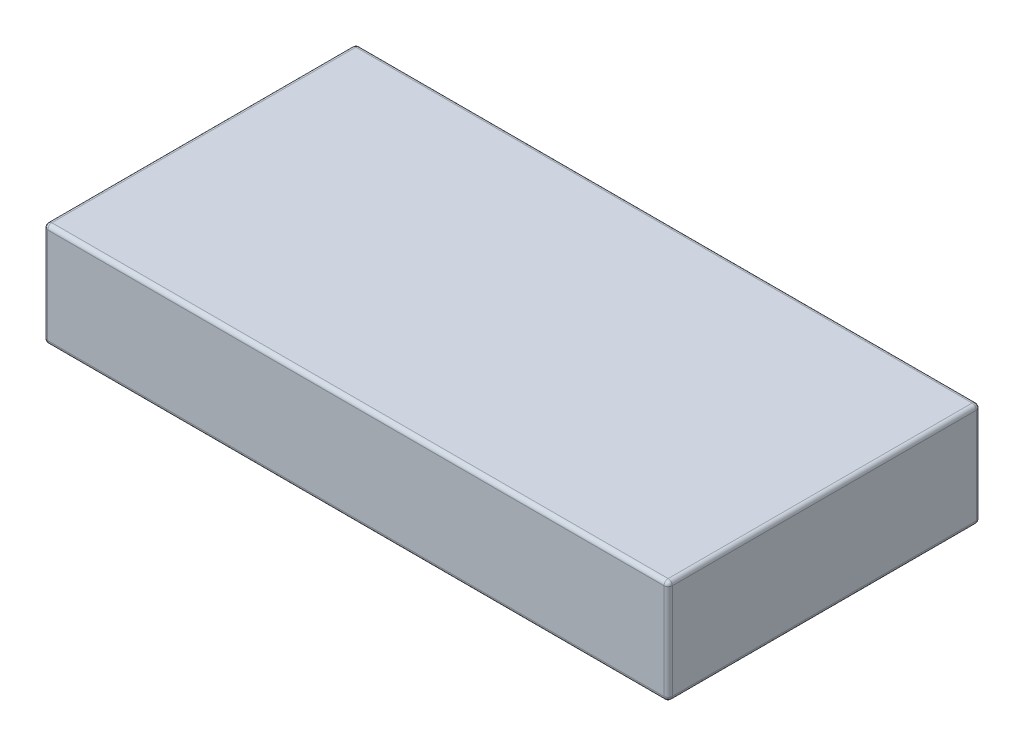
ISO-10303-21;
HEADER;
FILE_DESCRIPTION(('STEP AP214'),'2;1');
FILE_NAME('part.step','',(''),(''),'','','');
FILE_SCHEMA(('AUTOMOTIVE_DESIGN { 1 0 10303 214 1 1 1 1 }'));
ENDSEC;
DATA;
#1=APPLICATION_CONTEXT('core data for automotive mechanical design processes');
#2=APPLICATION_PROTOCOL_DEFINITION('international standard','automotive_design',2000,#1);
#3=PRODUCT_CONTEXT('',#1,'mechanical');
#4=PRODUCT('Part','Part','',(#3));
#5=PRODUCT_RELATED_PRODUCT_CATEGORY('part','',(#4));
#6=PRODUCT_DEFINITION_FORMATION('','',#4);
#7=PRODUCT_DEFINITION_CONTEXT('part definition',#1,'design');
#8=PRODUCT_DEFINITION('design','',#6,#7);
#9=PRODUCT_DEFINITION_SHAPE('','',#8);
#10=(LENGTH_UNIT() NAMED_UNIT(*) SI_UNIT(.MILLI.,.METRE.));
#11=(NAMED_UNIT(*) PLANE_ANGLE_UNIT() SI_UNIT($,.RADIAN.));
#12=(NAMED_UNIT(*) SI_UNIT($,.STERADIAN.) SOLID_ANGLE_UNIT());
#13=UNCERTAINTY_MEASURE_WITH_UNIT(LENGTH_MEASURE(1.E-05),#10,'distance_accuracy_value','');
#14=(GEOMETRIC_REPRESENTATION_CONTEXT(3) GLOBAL_UNCERTAINTY_ASSIGNED_CONTEXT((#13)) GLOBAL_UNIT_ASSIGNED_CONTEXT((#10,
#11,#12)) REPRESENTATION_CONTEXT('',''));
#15=CARTESIAN_POINT('',(0.,0.,0.));
#16=DIRECTION('',(0.,0.,1.));
#17=DIRECTION('',(1.,0.,0.));
#18=AXIS2_PLACEMENT_3D('',#15,#16,#17);
#19=CARTESIAN_POINT('',(-15.,5.,7.5));
#20=DIRECTION('',(1.,0.,0.));
#21=DIRECTION('',(0.,0.,-1.));
#22=AXIS2_PLACEMENT_3D('',#19,#20,#21);
#23=PLANE('',#22);
#24=DIRECTION('',(0.,-1.,0.));
#25=VECTOR('',#24,1.);
#26=CARTESIAN_POINT('',(-15.,5.,-7.3));
#27=LINE('',#26,#25);
#28=CARTESIAN_POINT('',(-15.,4.8,-7.3));
#29=VERTEX_POINT('',#28);
#30=CARTESIAN_POINT('',(-15.,0.2,-7.3));
#31=VERTEX_POINT('',#30);
#32=EDGE_CURVE('E270',#29,#31,#27,.T.);
#33=ORIENTED_EDGE('',*,*,#32,.T.);
#34=DIRECTION('',(0.,0.,1.));
#35=VECTOR('',#34,1.);
#36=CARTESIAN_POINT('',(-15.,0.2,-1.5));
#37=LINE('',#36,#35);
#38=CARTESIAN_POINT('',(-15.,0.2,-1.5));
#39=VERTEX_POINT('',#38);
#40=EDGE_CURVE('E273',#31,#39,#37,.T.);
#41=ORIENTED_EDGE('',*,*,#40,.T.);
#42=DIRECTION('',(0.,-1.,0.));
#43=VECTOR('',#42,1.);
#44=CARTESIAN_POINT('',(-15.,0.,-1.5));
#45=LINE('',#44,#43);
#46=CARTESIAN_POINT('',(-15.,0.677124344467704,-1.5));
#47=VERTEX_POINT('',#46);
#48=EDGE_CURVE('E226',#47,#39,#45,.T.);
#49=ORIENTED_EDGE('',*,*,#48,.F.);
#50=CARTESIAN_POINT('',(-15.,2.,0.));
#51=DIRECTION('',(-1.,0.,0.));
#52=DIRECTION('',(0.,0.,1.));
#53=AXIS2_PLACEMENT_3D('',#50,#51,#52);
#54=CIRCLE('',#53,2.);
#55=CARTESIAN_POINT('',(-15.,1.55559027913422,-1.95));
#56=VERTEX_POINT('',#55);
#57=EDGE_CURVE('E224',#56,#47,#54,.T.);
#58=ORIENTED_EDGE('',*,*,#57,.F.);
#59=DIRECTION('',(0.,-1.,0.));
#60=VECTOR('',#59,1.);
#61=CARTESIAN_POINT('',(-15.,2.8,-1.95));
#62=LINE('',#61,#60);
#63=CARTESIAN_POINT('',(-15.,2.8,-1.95));
#64=VERTEX_POINT('',#63);
#65=EDGE_CURVE('E190',#64,#56,#62,.T.);
#66=ORIENTED_EDGE('',*,*,#65,.F.);
#67=DIRECTION('',(0.,0.,-1.));
#68=VECTOR('',#67,1.);
#69=CARTESIAN_POINT('',(-15.,2.8,-1.95));
#70=LINE('',#69,#68);
#71=CARTESIAN_POINT('',(-15.,2.8,1.95));
#72=VERTEX_POINT('',#71);
#73=EDGE_CURVE('E208',#72,#64,#70,.T.);
#74=ORIENTED_EDGE('',*,*,#73,.F.);
#75=DIRECTION('',(0.,1.,0.));
#76=VECTOR('',#75,1.);
#77=CARTESIAN_POINT('',(-15.,2.8,1.95));
#78=LINE('',#77,#76);
#79=CARTESIAN_POINT('',(-15.,1.55559027913422,1.95));
#80=VERTEX_POINT('',#79);
#81=EDGE_CURVE('E211',#80,#72,#78,.T.);
#82=ORIENTED_EDGE('',*,*,#81,.F.);
#83=CARTESIAN_POINT('',(-15.,2.,0.));
#84=DIRECTION('',(-1.,0.,0.));
#85=DIRECTION('',(0.,0.,1.));
#86=AXIS2_PLACEMENT_3D('',#83,#84,#85);
#87=CIRCLE('',#86,2.);
#88=CARTESIAN_POINT('',(-15.,0.677124344467705,1.5));
#89=VERTEX_POINT('',#88);
#90=EDGE_CURVE('E231',#89,#80,#87,.T.);
#91=ORIENTED_EDGE('',*,*,#90,.F.);
#92=DIRECTION('',(0.,1.,0.));
#93=VECTOR('',#92,1.);
#94=CARTESIAN_POINT('',(-15.,0.,1.5));
#95=LINE('',#94,#93);
#96=CARTESIAN_POINT('',(-15.,0.2,1.5));
#97=VERTEX_POINT('',#96);
#98=EDGE_CURVE('E229',#97,#89,#95,.T.);
#99=ORIENTED_EDGE('',*,*,#98,.F.);
#100=DIRECTION('',(0.,0.,1.));
#101=VECTOR('',#100,1.);
#102=CARTESIAN_POINT('',(-15.,0.2,7.5));
#103=LINE('',#102,#101);
#104=CARTESIAN_POINT('',(-15.,0.2,7.3));
#105=VERTEX_POINT('',#104);
#106=EDGE_CURVE('E268',#97,#105,#103,.T.);
#107=ORIENTED_EDGE('',*,*,#106,.T.);
#108=DIRECTION('',(0.,-1.,0.));
#109=VECTOR('',#108,1.);
#110=CARTESIAN_POINT('',(-15.,5.,7.3));
#111=LINE('',#110,#109);
#112=CARTESIAN_POINT('',(-15.,4.8,7.3));
#113=VERTEX_POINT('',#112);
#114=EDGE_CURVE('E266',#105,#113,#111,.F.);
#115=ORIENTED_EDGE('',*,*,#114,.T.);
#116=DIRECTION('',(0.,0.,1.));
#117=VECTOR('',#116,1.);
#118=CARTESIAN_POINT('',(-15.,4.8,7.5));
#119=LINE('',#118,#117);
#120=EDGE_CURVE('E264',#113,#29,#119,.F.);
#121=ORIENTED_EDGE('',*,*,#120,.T.);
#122=EDGE_LOOP('',(#33,#41,#49,#58,#66,#74,#82,#91,#99,#107,#115,#121));
#123=FACE_BOUND('',#122,.T.);
#124=ADVANCED_FACE('F34',(#123),#23,.F.);
#125=CARTESIAN_POINT('',(-15.,5.,7.5));
#126=DIRECTION('',(0.,0.,-1.));
#127=DIRECTION('',(-1.,0.,0.));
#128=AXIS2_PLACEMENT_3D('',#125,#126,#127);
#129=PLANE('',#128);
#130=DIRECTION('',(0.,-1.,0.));
#131=VECTOR('',#130,1.);
#132=CARTESIAN_POINT('',(-14.8,5.,7.5));
#133=LINE('',#132,#131);
#134=CARTESIAN_POINT('',(-14.8,4.8,7.5));
#135=VERTEX_POINT('',#134);
#136=CARTESIAN_POINT('',(-14.8,0.2,7.5));
#137=VERTEX_POINT('',#136);
#138=EDGE_CURVE('E302',#135,#137,#133,.T.);
#139=ORIENTED_EDGE('',*,*,#138,.T.);
#140=DIRECTION('',(1.,0.,0.));
#141=VECTOR('',#140,1.);
#142=CARTESIAN_POINT('',(15.,0.2,7.5));
#143=LINE('',#142,#141);
#144=CARTESIAN_POINT('',(14.8,0.2,7.5));
#145=VERTEX_POINT('',#144);
#146=EDGE_CURVE('E305',#137,#145,#143,.T.);
#147=ORIENTED_EDGE('',*,*,#146,.T.);
#148=DIRECTION('',(0.,-1.,0.));
#149=VECTOR('',#148,1.);
#150=CARTESIAN_POINT('',(14.8,5.,7.5));
#151=LINE('',#150,#149);
#152=CARTESIAN_POINT('',(14.8,4.8,7.5));
#153=VERTEX_POINT('',#152);
#154=EDGE_CURVE('E300',#145,#153,#151,.F.);
#155=ORIENTED_EDGE('',*,*,#154,.T.);
#156=DIRECTION('',(1.,0.,0.));
#157=VECTOR('',#156,1.);
#158=CARTESIAN_POINT('',(-15.,4.8,7.5));
#159=LINE('',#158,#157);
#160=EDGE_CURVE('E298',#153,#135,#159,.F.);
#161=ORIENTED_EDGE('',*,*,#160,.T.);
#162=EDGE_LOOP('',(#139,#147,#155,#161));
#163=FACE_BOUND('',#162,.T.);
#164=ADVANCED_FACE('F443',(#163),#129,.F.);
#165=CARTESIAN_POINT('',(15.,5.,7.5));
#166=DIRECTION('',(-1.,0.,0.));
#167=DIRECTION('',(0.,0.,1.));
#168=AXIS2_PLACEMENT_3D('',#165,#166,#167);
#169=PLANE('',#168);
#170=DIRECTION('',(0.,0.,-1.));
#171=VECTOR('',#170,1.);
#172=CARTESIAN_POINT('',(15.,0.2,-7.5));
#173=LINE('',#172,#171);
#174=CARTESIAN_POINT('',(15.,0.2,7.3));
#175=VERTEX_POINT('',#174);
#176=CARTESIAN_POINT('',(15.,0.2,-7.3));
#177=VERTEX_POINT('',#176);
#178=EDGE_CURVE('E259',#175,#177,#173,.T.);
#179=ORIENTED_EDGE('',*,*,#178,.T.);
#180=DIRECTION('',(0.,-1.,0.));
#181=VECTOR('',#180,1.);
#182=CARTESIAN_POINT('',(15.,5.,-7.3));
#183=LINE('',#182,#181);
#184=CARTESIAN_POINT('',(15.,4.8,-7.3));
#185=VERTEX_POINT('',#184);
#186=EDGE_CURVE('E261',#177,#185,#183,.F.);
#187=ORIENTED_EDGE('',*,*,#186,.T.);
#188=DIRECTION('',(0.,0.,-1.));
#189=VECTOR('',#188,1.);
#190=CARTESIAN_POINT('',(15.,4.8,7.5));
#191=LINE('',#190,#189);
#192=CARTESIAN_POINT('',(15.,4.8,7.3));
#193=VERTEX_POINT('',#192);
#194=EDGE_CURVE('E255',#185,#193,#191,.F.);
#195=ORIENTED_EDGE('',*,*,#194,.T.);
#196=DIRECTION('',(0.,-1.,0.));
#197=VECTOR('',#196,1.);
#198=CARTESIAN_POINT('',(15.,5.,7.3));
#199=LINE('',#198,#197);
#200=EDGE_CURVE('E257',#193,#175,#199,.T.);
#201=ORIENTED_EDGE('',*,*,#200,.T.);
#202=EDGE_LOOP('',(#179,#187,#195,#201));
#203=FACE_BOUND('',#202,.T.);
#204=ADVANCED_FACE('F495',(#203),#169,.F.);
#205=CARTESIAN_POINT('',(-15.,5.,-7.5));
#206=DIRECTION('',(0.,0.,1.));
#207=DIRECTION('',(1.,0.,0.));
#208=AXIS2_PLACEMENT_3D('',#205,#206,#207);
#209=PLANE('',#208);
#210=DIRECTION('',(0.,-1.,0.));
#211=VECTOR('',#210,1.);
#212=CARTESIAN_POINT('',(14.8,5.,-7.5));
#213=LINE('',#212,#211);
#214=CARTESIAN_POINT('',(14.8,4.8,-7.5));
#215=VERTEX_POINT('',#214);
#216=CARTESIAN_POINT('',(14.8,0.2,-7.5));
#217=VERTEX_POINT('',#216);
#218=EDGE_CURVE('E250',#215,#217,#213,.T.);
#219=ORIENTED_EDGE('',*,*,#218,.T.);
#220=DIRECTION('',(-1.,0.,0.));
#221=VECTOR('',#220,1.);
#222=CARTESIAN_POINT('',(-15.,0.2,-7.5));
#223=LINE('',#222,#221);
#224=CARTESIAN_POINT('',(-14.8,0.2,-7.5));
#225=VERTEX_POINT('',#224);
#226=EDGE_CURVE('E253',#217,#225,#223,.T.);
#227=ORIENTED_EDGE('',*,*,#226,.T.);
#228=DIRECTION('',(0.,-1.,0.));
#229=VECTOR('',#228,1.);
#230=CARTESIAN_POINT('',(-14.8,5.,-7.5));
#231=LINE('',#230,#229);
#232=CARTESIAN_POINT('',(-14.8,4.8,-7.5));
#233=VERTEX_POINT('',#232);
#234=EDGE_CURVE('E248',#225,#233,#231,.F.);
#235=ORIENTED_EDGE('',*,*,#234,.T.);
#236=DIRECTION('',(-1.,0.,0.));
#237=VECTOR('',#236,1.);
#238=CARTESIAN_POINT('',(-15.,4.8,-7.5));
#239=LINE('',#238,#237);
#240=EDGE_CURVE('E238',#233,#215,#239,.F.);
#241=ORIENTED_EDGE('',*,*,#240,.T.);
#242=EDGE_LOOP('',(#219,#227,#235,#241));
#243=FACE_BOUND('',#242,.T.);
#244=ADVANCED_FACE('F508',(#243),#209,.F.);
#245=CARTESIAN_POINT('',(-15.,5.,-7.5));
#246=DIRECTION('',(0.,-1.,0.));
#247=DIRECTION('',(0.,0.,-1.));
#248=AXIS2_PLACEMENT_3D('',#245,#246,#247);
#249=PLANE('',#248);
#250=DIRECTION('',(0.,0.,-1.));
#251=VECTOR('',#250,1.);
#252=CARTESIAN_POINT('',(14.8,5.,-7.5));
#253=LINE('',#252,#251);
#254=CARTESIAN_POINT('',(14.8,5.,7.3));
#255=VERTEX_POINT('',#254);
#256=CARTESIAN_POINT('',(14.8,5.,-7.3));
#257=VERTEX_POINT('',#256);
#258=EDGE_CURVE('E43',#255,#257,#253,.T.);
#259=ORIENTED_EDGE('',*,*,#258,.T.);
#260=DIRECTION('',(-1.,0.,0.));
#261=VECTOR('',#260,1.);
#262=CARTESIAN_POINT('',(-15.,5.,-7.3));
#263=LINE('',#262,#261);
#264=CARTESIAN_POINT('',(-14.8,5.,-7.3));
#265=VERTEX_POINT('',#264);
#266=EDGE_CURVE('E11',#257,#265,#263,.T.);
#267=ORIENTED_EDGE('',*,*,#266,.T.);
#268=DIRECTION('',(0.,0.,1.));
#269=VECTOR('',#268,1.);
#270=CARTESIAN_POINT('',(-14.8,5.,-7.5));
#271=LINE('',#270,#269);
#272=CARTESIAN_POINT('',(-14.8,5.,7.3));
#273=VERTEX_POINT('',#272);
#274=EDGE_CURVE('E307',#265,#273,#271,.T.);
#275=ORIENTED_EDGE('',*,*,#274,.T.);
#276=DIRECTION('',(1.,0.,0.));
#277=VECTOR('',#276,1.);
#278=CARTESIAN_POINT('',(-15.,5.,7.3));
#279=LINE('',#278,#277);
#280=EDGE_CURVE('E54',#273,#255,#279,.T.);
#281=ORIENTED_EDGE('',*,*,#280,.T.);
#282=EDGE_LOOP('',(#259,#267,#275,#281));
#283=FACE_BOUND('',#282,.T.);
#284=ADVANCED_FACE('F506',(#283),#249,.F.);
#285=CARTESIAN_POINT('',(-15.,0.,-7.5));
#286=DIRECTION('',(0.,-1.,0.));
#287=DIRECTION('',(0.,0.,-1.));
#288=AXIS2_PLACEMENT_3D('',#285,#286,#287);
#289=PLANE('',#288);
#290=DIRECTION('',(0.,0.,1.));
#291=VECTOR('',#290,1.);
#292=CARTESIAN_POINT('',(-14.8,0.,-7.5));
#293=LINE('',#292,#291);
#294=CARTESIAN_POINT('',(-14.8,0.,-1.7));
#295=VERTEX_POINT('',#294);
#296=CARTESIAN_POINT('',(-14.8,0.,-7.3));
#297=VERTEX_POINT('',#296);
#298=EDGE_CURVE('E288',#295,#297,#293,.F.);
#299=ORIENTED_EDGE('',*,*,#298,.T.);
#300=DIRECTION('',(-1.,0.,0.));
#301=VECTOR('',#300,1.);
#302=CARTESIAN_POINT('',(15.,0.,-7.3));
#303=LINE('',#302,#301);
#304=CARTESIAN_POINT('',(14.8,0.,-7.3));
#305=VERTEX_POINT('',#304);
#306=EDGE_CURVE('E290',#297,#305,#303,.F.);
#307=ORIENTED_EDGE('',*,*,#306,.T.);
#308=DIRECTION('',(0.,0.,-1.));
#309=VECTOR('',#308,1.);
#310=CARTESIAN_POINT('',(14.8,0.,7.5));
#311=LINE('',#310,#309);
#312=CARTESIAN_POINT('',(14.8,0.,7.3));
#313=VERTEX_POINT('',#312);
#314=EDGE_CURVE('E277',#305,#313,#311,.F.);
#315=ORIENTED_EDGE('',*,*,#314,.T.);
#316=DIRECTION('',(1.,0.,0.));
#317=VECTOR('',#316,1.);
#318=CARTESIAN_POINT('',(-15.,0.,7.3));
#319=LINE('',#318,#317);
#320=CARTESIAN_POINT('',(-14.8,0.,7.3));
#321=VERTEX_POINT('',#320);
#322=EDGE_CURVE('E275',#313,#321,#319,.F.);
#323=ORIENTED_EDGE('',*,*,#322,.T.);
#324=DIRECTION('',(0.,0.,1.));
#325=VECTOR('',#324,1.);
#326=CARTESIAN_POINT('',(-14.8,0.,1.5));
#327=LINE('',#326,#325);
#328=CARTESIAN_POINT('',(-14.8,0.,1.7));
#329=VERTEX_POINT('',#328);
#330=EDGE_CURVE('E279',#321,#329,#327,.F.);
#331=ORIENTED_EDGE('',*,*,#330,.T.);
#332=DIRECTION('',(-1.,0.,0.));
#333=VECTOR('',#332,1.);
#334=CARTESIAN_POINT('',(9.45,0.,1.7));
#335=LINE('',#334,#333);
#336=CARTESIAN_POINT('',(9.65,0.,1.7));
#337=VERTEX_POINT('',#336);
#338=EDGE_CURVE('E282',#329,#337,#335,.F.);
#339=ORIENTED_EDGE('',*,*,#338,.T.);
#340=DIRECTION('',(0.,0.,1.));
#341=VECTOR('',#340,1.);
#342=CARTESIAN_POINT('',(9.65,0.,-7.5));
#343=LINE('',#342,#341);
#344=CARTESIAN_POINT('',(9.65,0.,-1.7));
#345=VERTEX_POINT('',#344);
#346=EDGE_CURVE('E284',#337,#345,#343,.F.);
#347=ORIENTED_EDGE('',*,*,#346,.T.);
#348=DIRECTION('',(-1.,0.,0.));
#349=VECTOR('',#348,1.);
#350=CARTESIAN_POINT('',(-15.,0.,-1.7));
#351=LINE('',#350,#349);
#352=EDGE_CURVE('E286',#345,#295,#351,.T.);
#353=ORIENTED_EDGE('',*,*,#352,.T.);
#354=EDGE_LOOP('',(#299,#307,#315,#323,#331,#339,#347,#353));
#355=FACE_BOUND('',#354,.T.);
#356=ADVANCED_FACE('F428',(#355),#289,.T.);
#357=CARTESIAN_POINT('',(9.45,2.8,-1.95));
#358=DIRECTION('',(0.,0.,-1.));
#359=DIRECTION('',(0.,1.,0.));
#360=AXIS2_PLACEMENT_3D('',#357,#358,#359);
#361=PLANE('',#360);
#362=ORIENTED_EDGE('',*,*,#65,.T.);
#363=DIRECTION('',(-1.,0.,0.));
#364=VECTOR('',#363,1.);
#365=CARTESIAN_POINT('',(9.45,1.55559027913422,-1.95));
#366=LINE('',#365,#364);
#367=CARTESIAN_POINT('',(9.45,1.55559027913422,-1.95));
#368=VERTEX_POINT('',#367);
#369=EDGE_CURVE('E183',#368,#56,#366,.T.);
#370=ORIENTED_EDGE('',*,*,#369,.F.);
#371=DIRECTION('',(0.,-1.,0.));
#372=VECTOR('',#371,1.);
#373=CARTESIAN_POINT('',(9.45,2.8,-1.95));
#374=LINE('',#373,#372);
#375=CARTESIAN_POINT('',(9.45,2.8,-1.95));
#376=VERTEX_POINT('',#375);
#377=EDGE_CURVE('E187',#376,#368,#374,.T.);
#378=ORIENTED_EDGE('',*,*,#377,.F.);
#379=DIRECTION('',(-1.,0.,0.));
#380=VECTOR('',#379,1.);
#381=CARTESIAN_POINT('',(9.45,2.8,-1.95));
#382=LINE('',#381,#380);
#383=EDGE_CURVE('E236',#376,#64,#382,.T.);
#384=ORIENTED_EDGE('',*,*,#383,.T.);
#385=EDGE_LOOP('',(#362,#370,#378,#384));
#386=FACE_BOUND('',#385,.T.);
#387=ADVANCED_FACE('F185',(#386),#361,.F.);
#388=CARTESIAN_POINT('',(9.45,2.8,-1.95));
#389=DIRECTION('',(0.,1.,0.));
#390=DIRECTION('',(0.,0.,1.));
#391=AXIS2_PLACEMENT_3D('',#388,#389,#390);
#392=PLANE('',#391);
#393=ORIENTED_EDGE('',*,*,#73,.T.);
#394=ORIENTED_EDGE('',*,*,#383,.F.);
#395=DIRECTION('',(0.,0.,-1.));
#396=VECTOR('',#395,1.);
#397=CARTESIAN_POINT('',(9.45,2.8,-1.95));
#398=LINE('',#397,#396);
#399=CARTESIAN_POINT('',(9.45,2.8,1.95));
#400=VERTEX_POINT('',#399);
#401=EDGE_CURVE('E195',#400,#376,#398,.T.);
#402=ORIENTED_EDGE('',*,*,#401,.F.);
#403=DIRECTION('',(-1.,0.,0.));
#404=VECTOR('',#403,1.);
#405=CARTESIAN_POINT('',(9.45,2.8,1.95));
#406=LINE('',#405,#404);
#407=EDGE_CURVE('E239',#400,#72,#406,.T.);
#408=ORIENTED_EDGE('',*,*,#407,.T.);
#409=EDGE_LOOP('',(#393,#394,#402,#408));
#410=FACE_BOUND('',#409,.T.);
#411=ADVANCED_FACE('F586',(#410),#392,.F.);
#412=CARTESIAN_POINT('',(9.45,2.8,1.95));
#413=DIRECTION('',(0.,0.,1.));
#414=DIRECTION('',(0.,-1.,0.));
#415=AXIS2_PLACEMENT_3D('',#412,#413,#414);
#416=PLANE('',#415);
#417=ORIENTED_EDGE('',*,*,#81,.T.);
#418=ORIENTED_EDGE('',*,*,#407,.F.);
#419=DIRECTION('',(0.,1.,0.));
#420=VECTOR('',#419,1.);
#421=CARTESIAN_POINT('',(9.45,2.8,1.95));
#422=LINE('',#421,#420);
#423=CARTESIAN_POINT('',(9.45,1.55559027913422,1.95));
#424=VERTEX_POINT('',#423);
#425=EDGE_CURVE('E220',#424,#400,#422,.T.);
#426=ORIENTED_EDGE('',*,*,#425,.F.);
#427=DIRECTION('',(-1.,0.,0.));
#428=VECTOR('',#427,1.);
#429=CARTESIAN_POINT('',(9.45,1.55559027913422,1.95));
#430=LINE('',#429,#428);
#431=EDGE_CURVE('E241',#424,#80,#430,.T.);
#432=ORIENTED_EDGE('',*,*,#431,.T.);
#433=EDGE_LOOP('',(#417,#418,#426,#432));
#434=FACE_BOUND('',#433,.T.);
#435=ADVANCED_FACE('F589',(#434),#416,.F.);
#436=CARTESIAN_POINT('',(9.45,2.,0.));
#437=DIRECTION('',(-1.,0.,0.));
#438=DIRECTION('',(0.,0.,1.));
#439=AXIS2_PLACEMENT_3D('',#436,#437,#438);
#440=CYLINDRICAL_SURFACE('',#439,2.);
#441=ORIENTED_EDGE('',*,*,#90,.T.);
#442=ORIENTED_EDGE('',*,*,#431,.F.);
#443=CARTESIAN_POINT('',(9.45,2.,0.));
#444=DIRECTION('',(-1.,0.,0.));
#445=DIRECTION('',(0.,0.,1.));
#446=AXIS2_PLACEMENT_3D('',#443,#444,#445);
#447=CIRCLE('',#446,2.);
#448=CARTESIAN_POINT('',(9.45,0.677124344467705,1.5));
#449=VERTEX_POINT('',#448);
#450=EDGE_CURVE('E217',#449,#424,#447,.T.);
#451=ORIENTED_EDGE('',*,*,#450,.F.);
#452=DIRECTION('',(-1.,0.,0.));
#453=VECTOR('',#452,1.);
#454=CARTESIAN_POINT('',(9.45,0.677124344467705,1.5));
#455=LINE('',#454,#453);
#456=EDGE_CURVE('E243',#449,#89,#455,.T.);
#457=ORIENTED_EDGE('',*,*,#456,.T.);
#458=EDGE_LOOP('',(#441,#442,#451,#457));
#459=FACE_BOUND('',#458,.T.);
#460=ADVANCED_FACE('F410',(#459),#440,.F.);
#461=CARTESIAN_POINT('',(9.45,0.,1.5));
#462=DIRECTION('',(0.,0.,1.));
#463=DIRECTION('',(1.,0.,0.));
#464=AXIS2_PLACEMENT_3D('',#461,#462,#463);
#465=PLANE('',#464);
#466=DIRECTION('',(0.,1.,0.));
#467=VECTOR('',#466,1.);
#468=CARTESIAN_POINT('',(9.45,0.,1.5));
#469=LINE('',#468,#467);
#470=CARTESIAN_POINT('',(9.45,0.2,1.5));
#471=VERTEX_POINT('',#470);
#472=EDGE_CURVE('E215',#471,#449,#469,.T.);
#473=ORIENTED_EDGE('',*,*,#472,.F.);
#474=DIRECTION('',(-1.,0.,0.));
#475=VECTOR('',#474,1.);
#476=CARTESIAN_POINT('',(-15.,0.2,1.5));
#477=LINE('',#476,#475);
#478=EDGE_CURVE('E296',#471,#97,#477,.T.);
#479=ORIENTED_EDGE('',*,*,#478,.T.);
#480=ORIENTED_EDGE('',*,*,#98,.T.);
#481=ORIENTED_EDGE('',*,*,#456,.F.);
#482=EDGE_LOOP('',(#473,#479,#480,#481));
#483=FACE_BOUND('',#482,.T.);
#484=ADVANCED_FACE('F402',(#483),#465,.F.);
#485=CARTESIAN_POINT('',(9.45,0.,-1.5));
#486=DIRECTION('',(0.,0.,-1.));
#487=DIRECTION('',(-1.,0.,0.));
#488=AXIS2_PLACEMENT_3D('',#485,#486,#487);
#489=PLANE('',#488);
#490=ORIENTED_EDGE('',*,*,#48,.T.);
#491=DIRECTION('',(-1.,0.,0.));
#492=VECTOR('',#491,1.);
#493=CARTESIAN_POINT('',(9.45,0.2,-1.5));
#494=LINE('',#493,#492);
#495=CARTESIAN_POINT('',(9.45,0.2,-1.5));
#496=VERTEX_POINT('',#495);
#497=EDGE_CURVE('E292',#39,#496,#494,.F.);
#498=ORIENTED_EDGE('',*,*,#497,.T.);
#499=DIRECTION('',(0.,-1.,0.));
#500=VECTOR('',#499,1.);
#501=CARTESIAN_POINT('',(9.45,0.,-1.5));
#502=LINE('',#501,#500);
#503=CARTESIAN_POINT('',(9.45,0.677124344467704,-1.5));
#504=VERTEX_POINT('',#503);
#505=EDGE_CURVE('E203',#504,#496,#502,.T.);
#506=ORIENTED_EDGE('',*,*,#505,.F.);
#507=DIRECTION('',(-1.,0.,0.));
#508=VECTOR('',#507,1.);
#509=CARTESIAN_POINT('',(9.45,0.677124344467704,-1.5));
#510=LINE('',#509,#508);
#511=EDGE_CURVE('E194',#504,#47,#510,.T.);
#512=ORIENTED_EDGE('',*,*,#511,.T.);
#513=EDGE_LOOP('',(#490,#498,#506,#512));
#514=FACE_BOUND('',#513,.T.);
#515=ADVANCED_FACE('F414',(#514),#489,.F.);
#516=CARTESIAN_POINT('',(9.45,2.,0.));
#517=DIRECTION('',(-1.,0.,0.));
#518=DIRECTION('',(0.,0.,1.));
#519=AXIS2_PLACEMENT_3D('',#516,#517,#518);
#520=CYLINDRICAL_SURFACE('',#519,2.);
#521=ORIENTED_EDGE('',*,*,#57,.T.);
#522=ORIENTED_EDGE('',*,*,#511,.F.);
#523=CARTESIAN_POINT('',(9.45,2.,0.));
#524=DIRECTION('',(-1.,0.,0.));
#525=DIRECTION('',(0.,0.,1.));
#526=AXIS2_PLACEMENT_3D('',#523,#524,#525);
#527=CIRCLE('',#526,2.);
#528=EDGE_CURVE('E198',#368,#504,#527,.T.);
#529=ORIENTED_EDGE('',*,*,#528,.F.);
#530=ORIENTED_EDGE('',*,*,#369,.T.);
#531=EDGE_LOOP('',(#521,#522,#529,#530));
#532=FACE_BOUND('',#531,.T.);
#533=ADVANCED_FACE('F199',(#532),#520,.F.);
#534=CARTESIAN_POINT('',(9.45,2.,0.));
#535=DIRECTION('',(-1.,0.,0.));
#536=DIRECTION('',(0.,0.,1.));
#537=AXIS2_PLACEMENT_3D('',#534,#535,#536);
#538=PLANE('',#537);
#539=ORIENTED_EDGE('',*,*,#505,.T.);
#540=DIRECTION('',(0.,0.,1.));
#541=VECTOR('',#540,1.);
#542=CARTESIAN_POINT('',(9.45,0.2,0.));
#543=LINE('',#542,#541);
#544=EDGE_CURVE('E294',#496,#471,#543,.T.);
#545=ORIENTED_EDGE('',*,*,#544,.T.);
#546=ORIENTED_EDGE('',*,*,#472,.T.);
#547=ORIENTED_EDGE('',*,*,#450,.T.);
#548=ORIENTED_EDGE('',*,*,#425,.T.);
#549=ORIENTED_EDGE('',*,*,#401,.T.);
#550=ORIENTED_EDGE('',*,*,#377,.T.);
#551=ORIENTED_EDGE('',*,*,#528,.T.);
#552=EDGE_LOOP('',(#539,#545,#546,#547,#548,#549,#550,#551));
#553=FACE_BOUND('',#552,.T.);
#554=ADVANCED_FACE('F205',(#553),#538,.T.);
#555=CARTESIAN_POINT('',(9.45,0.2,1.7));
#556=DIRECTION('',(1.,0.,0.));
#557=DIRECTION('',(0.,0.,-1.));
#558=AXIS2_PLACEMENT_3D('',#555,#556,#557);
#559=CYLINDRICAL_SURFACE('',#558,0.2);
#560=CARTESIAN_POINT('',(-14.8,0.2,1.7));
#561=DIRECTION('',(0.707106781186547,0.,-0.707106781186547));
#562=DIRECTION('',(0.707106781186547,0.,0.707106781186547));
#563=AXIS2_PLACEMENT_3D('',#560,#561,#562);
#564=ELLIPSE('',#563,0.282842712474619,0.2);
#565=EDGE_CURVE('E384',#97,#329,#564,.F.);
#566=ORIENTED_EDGE('',*,*,#565,.F.);
#567=ORIENTED_EDGE('',*,*,#478,.F.);
#568=CARTESIAN_POINT('',(9.65,0.2,1.7));
#569=DIRECTION('',(-0.707106781186547,0.,0.707106781186547));
#570=DIRECTION('',(0.707106781186547,0.,0.707106781186547));
#571=AXIS2_PLACEMENT_3D('',#568,#569,#570);
#572=ELLIPSE('',#571,0.282842712474619,0.2);
#573=EDGE_CURVE('E38',#337,#471,#572,.F.);
#574=ORIENTED_EDGE('',*,*,#573,.F.);
#575=ORIENTED_EDGE('',*,*,#338,.F.);
#576=EDGE_LOOP('',(#566,#567,#574,#575));
#577=FACE_BOUND('',#576,.T.);
#578=ADVANCED_FACE('F36',(#577),#559,.T.);
#579=CARTESIAN_POINT('',(9.65,0.2,0.));
#580=DIRECTION('',(0.,0.,1.));
#581=DIRECTION('',(1.,0.,0.));
#582=AXIS2_PLACEMENT_3D('',#579,#580,#581);
#583=CYLINDRICAL_SURFACE('',#582,0.2);
#584=ORIENTED_EDGE('',*,*,#573,.T.);
#585=ORIENTED_EDGE('',*,*,#544,.F.);
#586=CARTESIAN_POINT('',(9.65,0.2,-1.7));
#587=DIRECTION('',(0.707106781186547,0.,0.707106781186547));
#588=DIRECTION('',(0.707106781186547,0.,-0.707106781186547));
#589=AXIS2_PLACEMENT_3D('',#586,#587,#588);
#590=ELLIPSE('',#589,0.282842712474619,0.2);
#591=EDGE_CURVE('E379',#345,#496,#590,.F.);
#592=ORIENTED_EDGE('',*,*,#591,.F.);
#593=ORIENTED_EDGE('',*,*,#346,.F.);
#594=EDGE_LOOP('',(#584,#585,#592,#593));
#595=FACE_BOUND('',#594,.T.);
#596=ADVANCED_FACE('F395',(#595),#583,.T.);
#597=CARTESIAN_POINT('',(-14.8,0.2,7.5));
#598=DIRECTION('',(0.,0.,-1.));
#599=DIRECTION('',(-1.,0.,0.));
#600=AXIS2_PLACEMENT_3D('',#597,#598,#599);
#601=CYLINDRICAL_SURFACE('',#600,0.2);
#602=ORIENTED_EDGE('',*,*,#565,.T.);
#603=ORIENTED_EDGE('',*,*,#330,.F.);
#604=CARTESIAN_POINT('',(-14.8,0.2,7.3));
#605=DIRECTION('',(0.,0.,1.));
#606=DIRECTION('',(1.,0.,0.));
#607=AXIS2_PLACEMENT_3D('',#604,#605,#606);
#608=CIRCLE('',#607,0.2);
#609=EDGE_CURVE('E376',#105,#321,#608,.T.);
#610=ORIENTED_EDGE('',*,*,#609,.F.);
#611=ORIENTED_EDGE('',*,*,#106,.F.);
#612=EDGE_LOOP('',(#602,#603,#610,#611));
#613=FACE_BOUND('',#612,.T.);
#614=ADVANCED_FACE('F433',(#613),#601,.T.);
#615=CARTESIAN_POINT('',(-14.8,5.,7.3));
#616=DIRECTION('',(0.,-1.,0.));
#617=DIRECTION('',(0.,0.,-1.));
#618=AXIS2_PLACEMENT_3D('',#615,#616,#617);
#619=CYLINDRICAL_SURFACE('',#618,0.2);
#620=CARTESIAN_POINT('',(-14.8,4.8,7.3));
#621=DIRECTION('',(0.,1.,0.));
#622=DIRECTION('',(0.,0.,1.));
#623=AXIS2_PLACEMENT_3D('',#620,#621,#622);
#624=CIRCLE('',#623,0.2);
#625=EDGE_CURVE('E382',#113,#135,#624,.T.);
#626=ORIENTED_EDGE('',*,*,#625,.F.);
#627=ORIENTED_EDGE('',*,*,#114,.F.);
#628=CARTESIAN_POINT('',(-14.8,0.2,7.3));
#629=DIRECTION('',(0.,-1.,0.));
#630=DIRECTION('',(0.,0.,-1.));
#631=AXIS2_PLACEMENT_3D('',#628,#629,#630);
#632=CIRCLE('',#631,0.2);
#633=EDGE_CURVE('E373',#137,#105,#632,.T.);
#634=ORIENTED_EDGE('',*,*,#633,.F.);
#635=ORIENTED_EDGE('',*,*,#138,.F.);
#636=EDGE_LOOP('',(#626,#627,#634,#635));
#637=FACE_BOUND('',#636,.T.);
#638=ADVANCED_FACE('F460',(#637),#619,.T.);
#639=CARTESIAN_POINT('',(-14.8,4.8,7.3));
#640=DIRECTION('',(0.,0.,1.));
#641=DIRECTION('',(1.,0.,0.));
#642=AXIS2_PLACEMENT_3D('',#639,#640,#641);
#643=SPHERICAL_SURFACE('',#642,0.2);
#644=CARTESIAN_POINT('',(-14.8,4.8,7.3));
#645=DIRECTION('',(0.,0.,1.));
#646=DIRECTION('',(1.,0.,0.));
#647=AXIS2_PLACEMENT_3D('',#644,#645,#646);
#648=CIRCLE('',#647,0.2);
#649=EDGE_CURVE('E367',#113,#273,#648,.F.);
#650=ORIENTED_EDGE('',*,*,#649,.F.);
#651=ORIENTED_EDGE('',*,*,#625,.T.);
#652=CARTESIAN_POINT('',(-14.8,4.8,7.3));
#653=DIRECTION('',(-1.,0.,0.));
#654=DIRECTION('',(0.,0.,1.));
#655=AXIS2_PLACEMENT_3D('',#652,#653,#654);
#656=CIRCLE('',#655,0.2);
#657=EDGE_CURVE('E370',#273,#135,#656,.F.);
#658=ORIENTED_EDGE('',*,*,#657,.F.);
#659=EDGE_LOOP('',(#650,#651,#658));
#660=FACE_BOUND('',#659,.T.);
#661=ADVANCED_FACE('F463',(#660),#643,.T.);
#662=CARTESIAN_POINT('',(-15.,0.2,-1.7));
#663=DIRECTION('',(1.,0.,0.));
#664=DIRECTION('',(0.,0.,-1.));
#665=AXIS2_PLACEMENT_3D('',#662,#663,#664);
#666=CYLINDRICAL_SURFACE('',#665,0.2);
#667=ORIENTED_EDGE('',*,*,#591,.T.);
#668=ORIENTED_EDGE('',*,*,#497,.F.);
#669=CARTESIAN_POINT('',(-14.8,0.2,-1.7));
#670=DIRECTION('',(0.707106781186547,0.,0.707106781186547));
#671=DIRECTION('',(0.707106781186547,0.,-0.707106781186547));
#672=AXIS2_PLACEMENT_3D('',#669,#670,#671);
#673=ELLIPSE('',#672,0.282842712474619,0.2);
#674=EDGE_CURVE('E364',#295,#39,#673,.F.);
#675=ORIENTED_EDGE('',*,*,#674,.F.);
#676=ORIENTED_EDGE('',*,*,#352,.F.);
#677=EDGE_LOOP('',(#667,#668,#675,#676));
#678=FACE_BOUND('',#677,.T.);
#679=ADVANCED_FACE('F419',(#678),#666,.T.);
#680=CARTESIAN_POINT('',(-14.8,0.2,7.3));
#681=DIRECTION('',(0.,0.,1.));
#682=DIRECTION('',(1.,0.,0.));
#683=AXIS2_PLACEMENT_3D('',#680,#681,#682);
#684=SPHERICAL_SURFACE('',#683,0.2);
#685=ORIENTED_EDGE('',*,*,#633,.T.);
#686=ORIENTED_EDGE('',*,*,#609,.T.);
#687=CARTESIAN_POINT('',(-14.8,0.2,7.3));
#688=DIRECTION('',(-1.,0.,0.));
#689=DIRECTION('',(0.,0.,1.));
#690=AXIS2_PLACEMENT_3D('',#687,#688,#689);
#691=CIRCLE('',#690,0.2);
#692=EDGE_CURVE('E361',#137,#321,#691,.F.);
#693=ORIENTED_EDGE('',*,*,#692,.F.);
#694=EDGE_LOOP('',(#685,#686,#693));
#695=FACE_BOUND('',#694,.T.);
#696=ADVANCED_FACE('F436',(#695),#684,.T.);
#697=CARTESIAN_POINT('',(-15.,4.8,7.3));
#698=DIRECTION('',(1.,0.,0.));
#699=DIRECTION('',(0.,0.,-1.));
#700=AXIS2_PLACEMENT_3D('',#697,#698,#699);
#701=CYLINDRICAL_SURFACE('',#700,0.2);
#702=ORIENTED_EDGE('',*,*,#657,.T.);
#703=ORIENTED_EDGE('',*,*,#160,.F.);
#704=CARTESIAN_POINT('',(14.8,4.8,7.3));
#705=DIRECTION('',(1.,0.,0.));
#706=DIRECTION('',(0.,0.,-1.));
#707=AXIS2_PLACEMENT_3D('',#704,#705,#706);
#708=CIRCLE('',#707,0.2);
#709=EDGE_CURVE('E355',#255,#153,#708,.T.);
#710=ORIENTED_EDGE('',*,*,#709,.F.);
#711=ORIENTED_EDGE('',*,*,#280,.F.);
#712=EDGE_LOOP('',(#702,#703,#710,#711));
#713=FACE_BOUND('',#712,.T.);
#714=ADVANCED_FACE('F456',(#713),#701,.T.);
#715=CARTESIAN_POINT('',(-14.8,4.8,-7.5));
#716=DIRECTION('',(0.,0.,1.));
#717=DIRECTION('',(1.,0.,0.));
#718=AXIS2_PLACEMENT_3D('',#715,#716,#717);
#719=CYLINDRICAL_SURFACE('',#718,0.2);
#720=ORIENTED_EDGE('',*,*,#649,.T.);
#721=ORIENTED_EDGE('',*,*,#274,.F.);
#722=CARTESIAN_POINT('',(-14.8,4.8,-7.3));
#723=DIRECTION('',(0.,0.,-1.));
#724=DIRECTION('',(0.,1.,0.));
#725=AXIS2_PLACEMENT_3D('',#722,#723,#724);
#726=CIRCLE('',#725,0.2);
#727=EDGE_CURVE('E352',#29,#265,#726,.T.);
#728=ORIENTED_EDGE('',*,*,#727,.F.);
#729=ORIENTED_EDGE('',*,*,#120,.F.);
#730=EDGE_LOOP('',(#720,#721,#728,#729));
#731=FACE_BOUND('',#730,.T.);
#732=ADVANCED_FACE('F468',(#731),#719,.T.);
#733=CARTESIAN_POINT('',(-14.8,5.,-7.3));
#734=DIRECTION('',(0.,-1.,0.));
#735=DIRECTION('',(0.,0.,-1.));
#736=AXIS2_PLACEMENT_3D('',#733,#734,#735);
#737=CYLINDRICAL_SURFACE('',#736,0.2);
#738=CARTESIAN_POINT('',(-14.8,0.2,-7.3));
#739=DIRECTION('',(0.,-1.,0.));
#740=DIRECTION('',(0.,0.,-1.));
#741=AXIS2_PLACEMENT_3D('',#738,#739,#740);
#742=CIRCLE('',#741,0.2);
#743=EDGE_CURVE('E346',#31,#225,#742,.T.);
#744=ORIENTED_EDGE('',*,*,#743,.F.);
#745=ORIENTED_EDGE('',*,*,#32,.F.);
#746=CARTESIAN_POINT('',(-14.8,4.8,-7.3));
#747=DIRECTION('',(0.,1.,0.));
#748=DIRECTION('',(0.,0.,1.));
#749=AXIS2_PLACEMENT_3D('',#746,#747,#748);
#750=CIRCLE('',#749,0.2);
#751=EDGE_CURVE('E349',#233,#29,#750,.T.);
#752=ORIENTED_EDGE('',*,*,#751,.F.);
#753=ORIENTED_EDGE('',*,*,#234,.F.);
#754=EDGE_LOOP('',(#744,#745,#752,#753));
#755=FACE_BOUND('',#754,.T.);
#756=ADVANCED_FACE('F473',(#755),#737,.T.);
#757=CARTESIAN_POINT('',(-14.8,0.2,7.5));
#758=DIRECTION('',(0.,0.,-1.));
#759=DIRECTION('',(-1.,0.,0.));
#760=AXIS2_PLACEMENT_3D('',#757,#758,#759);
#761=CYLINDRICAL_SURFACE('',#760,0.2);
#762=ORIENTED_EDGE('',*,*,#674,.T.);
#763=ORIENTED_EDGE('',*,*,#40,.F.);
#764=CARTESIAN_POINT('',(-14.8,0.2,-7.3));
#765=DIRECTION('',(0.,0.,-1.));
#766=DIRECTION('',(-1.,0.,0.));
#767=AXIS2_PLACEMENT_3D('',#764,#765,#766);
#768=CIRCLE('',#767,0.2);
#769=EDGE_CURVE('E344',#297,#31,#768,.T.);
#770=ORIENTED_EDGE('',*,*,#769,.F.);
#771=ORIENTED_EDGE('',*,*,#298,.F.);
#772=EDGE_LOOP('',(#762,#763,#770,#771));
#773=FACE_BOUND('',#772,.T.);
#774=ADVANCED_FACE('F424',(#773),#761,.T.);
#775=CARTESIAN_POINT('',(-15.,0.2,7.3));
#776=DIRECTION('',(-1.,0.,0.));
#777=DIRECTION('',(0.,0.,1.));
#778=AXIS2_PLACEMENT_3D('',#775,#776,#777);
#779=CYLINDRICAL_SURFACE('',#778,0.2);
#780=ORIENTED_EDGE('',*,*,#692,.T.);
#781=ORIENTED_EDGE('',*,*,#322,.F.);
#782=CARTESIAN_POINT('',(14.8,0.2,7.3));
#783=DIRECTION('',(1.,0.,0.));
#784=DIRECTION('',(0.,0.,-1.));
#785=AXIS2_PLACEMENT_3D('',#782,#783,#784);
#786=CIRCLE('',#785,0.2);
#787=EDGE_CURVE('E341',#145,#313,#786,.T.);
#788=ORIENTED_EDGE('',*,*,#787,.F.);
#789=ORIENTED_EDGE('',*,*,#146,.F.);
#790=EDGE_LOOP('',(#780,#781,#788,#789));
#791=FACE_BOUND('',#790,.T.);
#792=ADVANCED_FACE('F439',(#791),#779,.T.);
#793=CARTESIAN_POINT('',(14.8,5.,7.3));
#794=DIRECTION('',(0.,-1.,0.));
#795=DIRECTION('',(0.,0.,-1.));
#796=AXIS2_PLACEMENT_3D('',#793,#794,#795);
#797=CYLINDRICAL_SURFACE('',#796,0.2);
#798=CARTESIAN_POINT('',(14.8,4.8,7.3));
#799=DIRECTION('',(0.,1.,0.));
#800=DIRECTION('',(0.,0.,1.));
#801=AXIS2_PLACEMENT_3D('',#798,#799,#800);
#802=CIRCLE('',#801,0.2);
#803=EDGE_CURVE('E358',#153,#193,#802,.T.);
#804=ORIENTED_EDGE('',*,*,#803,.F.);
#805=ORIENTED_EDGE('',*,*,#154,.F.);
#806=CARTESIAN_POINT('',(14.8,0.2,7.3));
#807=DIRECTION('',(0.,-1.,0.));
#808=DIRECTION('',(0.,0.,-1.));
#809=AXIS2_PLACEMENT_3D('',#806,#807,#808);
#810=CIRCLE('',#809,0.2);
#811=EDGE_CURVE('E338',#175,#145,#810,.T.);
#812=ORIENTED_EDGE('',*,*,#811,.F.);
#813=ORIENTED_EDGE('',*,*,#200,.F.);
#814=EDGE_LOOP('',(#804,#805,#812,#813));
#815=FACE_BOUND('',#814,.T.);
#816=ADVANCED_FACE('F449',(#815),#797,.T.);
#817=CARTESIAN_POINT('',(14.8,4.8,7.3));
#818=DIRECTION('',(0.,0.,1.));
#819=DIRECTION('',(1.,0.,0.));
#820=AXIS2_PLACEMENT_3D('',#817,#818,#819);
#821=SPHERICAL_SURFACE('',#820,0.2);
#822=ORIENTED_EDGE('',*,*,#709,.T.);
#823=ORIENTED_EDGE('',*,*,#803,.T.);
#824=CARTESIAN_POINT('',(14.8,4.8,7.3));
#825=DIRECTION('',(0.,0.,1.));
#826=DIRECTION('',(0.,-1.,0.));
#827=AXIS2_PLACEMENT_3D('',#824,#825,#826);
#828=CIRCLE('',#827,0.2);
#829=EDGE_CURVE('E335',#255,#193,#828,.F.);
#830=ORIENTED_EDGE('',*,*,#829,.F.);
#831=EDGE_LOOP('',(#822,#823,#830));
#832=FACE_BOUND('',#831,.T.);
#833=ADVANCED_FACE('F454',(#832),#821,.T.);
#834=CARTESIAN_POINT('',(-14.8,4.8,-7.3));
#835=DIRECTION('',(0.,0.,1.));
#836=DIRECTION('',(1.,0.,0.));
#837=AXIS2_PLACEMENT_3D('',#834,#835,#836);
#838=SPHERICAL_SURFACE('',#837,0.2);
#839=ORIENTED_EDGE('',*,*,#751,.T.);
#840=ORIENTED_EDGE('',*,*,#727,.T.);
#841=CARTESIAN_POINT('',(-14.8,4.8,-7.3));
#842=DIRECTION('',(-1.,0.,0.));
#843=DIRECTION('',(0.,0.,1.));
#844=AXIS2_PLACEMENT_3D('',#841,#842,#843);
#845=CIRCLE('',#844,0.2);
#846=EDGE_CURVE('E333',#233,#265,#845,.F.);
#847=ORIENTED_EDGE('',*,*,#846,.F.);
#848=EDGE_LOOP('',(#839,#840,#847));
#849=FACE_BOUND('',#848,.T.);
#850=ADVANCED_FACE('F546',(#849),#838,.T.);
#851=CARTESIAN_POINT('',(-14.8,0.2,-7.3));
#852=DIRECTION('',(0.,0.,1.));
#853=DIRECTION('',(1.,0.,0.));
#854=AXIS2_PLACEMENT_3D('',#851,#852,#853);
#855=SPHERICAL_SURFACE('',#854,0.2);
#856=ORIENTED_EDGE('',*,*,#769,.T.);
#857=ORIENTED_EDGE('',*,*,#743,.T.);
#858=CARTESIAN_POINT('',(-14.8,0.2,-7.3));
#859=DIRECTION('',(-1.,0.,0.));
#860=DIRECTION('',(0.,0.,1.));
#861=AXIS2_PLACEMENT_3D('',#858,#859,#860);
#862=CIRCLE('',#861,0.2);
#863=EDGE_CURVE('E330',#297,#225,#862,.F.);
#864=ORIENTED_EDGE('',*,*,#863,.F.);
#865=EDGE_LOOP('',(#856,#857,#864));
#866=FACE_BOUND('',#865,.T.);
#867=ADVANCED_FACE('F477',(#866),#855,.T.);
#868=CARTESIAN_POINT('',(14.8,0.2,7.3));
#869=DIRECTION('',(0.,0.,1.));
#870=DIRECTION('',(1.,0.,0.));
#871=AXIS2_PLACEMENT_3D('',#868,#869,#870);
#872=SPHERICAL_SURFACE('',#871,0.2);
#873=ORIENTED_EDGE('',*,*,#811,.T.);
#874=ORIENTED_EDGE('',*,*,#787,.T.);
#875=CARTESIAN_POINT('',(14.8,0.2,7.3));
#876=DIRECTION('',(0.,0.,1.));
#877=DIRECTION('',(1.,0.,0.));
#878=AXIS2_PLACEMENT_3D('',#875,#876,#877);
#879=CIRCLE('',#878,0.2);
#880=EDGE_CURVE('E327',#175,#313,#879,.F.);
#881=ORIENTED_EDGE('',*,*,#880,.F.);
#882=EDGE_LOOP('',(#873,#874,#881));
#883=FACE_BOUND('',#882,.T.);
#884=ADVANCED_FACE('F540',(#883),#872,.T.);
#885=CARTESIAN_POINT('',(14.8,4.8,-7.5));
#886=DIRECTION('',(0.,0.,-1.));
#887=DIRECTION('',(-1.,0.,0.));
#888=AXIS2_PLACEMENT_3D('',#885,#886,#887);
#889=CYLINDRICAL_SURFACE('',#888,0.2);
#890=ORIENTED_EDGE('',*,*,#829,.T.);
#891=ORIENTED_EDGE('',*,*,#194,.F.);
#892=CARTESIAN_POINT('',(14.8,4.8,-7.3));
#893=DIRECTION('',(0.,0.,-1.));
#894=DIRECTION('',(-1.,0.,0.));
#895=AXIS2_PLACEMENT_3D('',#892,#893,#894);
#896=CIRCLE('',#895,0.2);
#897=EDGE_CURVE('E324',#257,#185,#896,.T.);
#898=ORIENTED_EDGE('',*,*,#897,.F.);
#899=ORIENTED_EDGE('',*,*,#258,.F.);
#900=EDGE_LOOP('',(#890,#891,#898,#899));
#901=FACE_BOUND('',#900,.T.);
#902=ADVANCED_FACE('F499',(#901),#889,.T.);
#903=CARTESIAN_POINT('',(-15.,4.8,-7.3));
#904=DIRECTION('',(-1.,0.,0.));
#905=DIRECTION('',(0.,0.,1.));
#906=AXIS2_PLACEMENT_3D('',#903,#904,#905);
#907=CYLINDRICAL_SURFACE('',#906,0.2);
#908=ORIENTED_EDGE('',*,*,#846,.T.);
#909=ORIENTED_EDGE('',*,*,#266,.F.);
#910=CARTESIAN_POINT('',(14.8,4.8,-7.3));
#911=DIRECTION('',(1.,0.,0.));
#912=DIRECTION('',(0.,0.,-1.));
#913=AXIS2_PLACEMENT_3D('',#910,#911,#912);
#914=CIRCLE('',#913,0.2);
#915=EDGE_CURVE('E321',#215,#257,#914,.T.);
#916=ORIENTED_EDGE('',*,*,#915,.F.);
#917=ORIENTED_EDGE('',*,*,#240,.F.);
#918=EDGE_LOOP('',(#908,#909,#916,#917));
#919=FACE_BOUND('',#918,.T.);
#920=ADVANCED_FACE('F505',(#919),#907,.T.);
#921=CARTESIAN_POINT('',(-15.,0.2,-7.3));
#922=DIRECTION('',(1.,0.,0.));
#923=DIRECTION('',(0.,0.,-1.));
#924=AXIS2_PLACEMENT_3D('',#921,#922,#923);
#925=CYLINDRICAL_SURFACE('',#924,0.2);
#926=ORIENTED_EDGE('',*,*,#863,.T.);
#927=ORIENTED_EDGE('',*,*,#226,.F.);
#928=CARTESIAN_POINT('',(14.8,0.2,-7.3));
#929=DIRECTION('',(1.,0.,0.));
#930=DIRECTION('',(0.,0.,-1.));
#931=AXIS2_PLACEMENT_3D('',#928,#929,#930);
#932=CIRCLE('',#931,0.2);
#933=EDGE_CURVE('E318',#305,#217,#932,.T.);
#934=ORIENTED_EDGE('',*,*,#933,.F.);
#935=ORIENTED_EDGE('',*,*,#306,.F.);
#936=EDGE_LOOP('',(#926,#927,#934,#935));
#937=FACE_BOUND('',#936,.T.);
#938=ADVANCED_FACE('F480',(#937),#925,.T.);
#939=CARTESIAN_POINT('',(14.8,0.2,7.5));
#940=DIRECTION('',(0.,0.,1.));
#941=DIRECTION('',(1.,0.,0.));
#942=AXIS2_PLACEMENT_3D('',#939,#940,#941);
#943=CYLINDRICAL_SURFACE('',#942,0.2);
#944=ORIENTED_EDGE('',*,*,#880,.T.);
#945=ORIENTED_EDGE('',*,*,#314,.F.);
#946=CARTESIAN_POINT('',(14.8,0.2,-7.3));
#947=DIRECTION('',(0.,0.,-1.));
#948=DIRECTION('',(-1.,0.,0.));
#949=AXIS2_PLACEMENT_3D('',#946,#947,#948);
#950=CIRCLE('',#949,0.2);
#951=EDGE_CURVE('E315',#177,#305,#950,.T.);
#952=ORIENTED_EDGE('',*,*,#951,.F.);
#953=ORIENTED_EDGE('',*,*,#178,.F.);
#954=EDGE_LOOP('',(#944,#945,#952,#953));
#955=FACE_BOUND('',#954,.T.);
#956=ADVANCED_FACE('F489',(#955),#943,.T.);
#957=CARTESIAN_POINT('',(14.8,4.8,-7.3));
#958=DIRECTION('',(0.,0.,1.));
#959=DIRECTION('',(1.,0.,0.));
#960=AXIS2_PLACEMENT_3D('',#957,#958,#959);
#961=SPHERICAL_SURFACE('',#960,0.2);
#962=ORIENTED_EDGE('',*,*,#915,.T.);
#963=ORIENTED_EDGE('',*,*,#897,.T.);
#964=CARTESIAN_POINT('',(14.8,4.8,-7.3));
#965=DIRECTION('',(0.,1.,0.));
#966=DIRECTION('',(0.,0.,1.));
#967=AXIS2_PLACEMENT_3D('',#964,#965,#966);
#968=CIRCLE('',#967,0.2);
#969=EDGE_CURVE('E313',#215,#185,#968,.F.);
#970=ORIENTED_EDGE('',*,*,#969,.F.);
#971=EDGE_LOOP('',(#962,#963,#970));
#972=FACE_BOUND('',#971,.T.);
#973=ADVANCED_FACE('F502',(#972),#961,.T.);
#974=CARTESIAN_POINT('',(14.8,0.2,-7.3));
#975=DIRECTION('',(0.,0.,1.));
#976=DIRECTION('',(1.,0.,0.));
#977=AXIS2_PLACEMENT_3D('',#974,#975,#976);
#978=SPHERICAL_SURFACE('',#977,0.2);
#979=ORIENTED_EDGE('',*,*,#951,.T.);
#980=ORIENTED_EDGE('',*,*,#933,.T.);
#981=CARTESIAN_POINT('',(14.8,0.2,-7.3));
#982=DIRECTION('',(0.,-1.,0.));
#983=DIRECTION('',(0.,0.,-1.));
#984=AXIS2_PLACEMENT_3D('',#981,#982,#983);
#985=CIRCLE('',#984,0.2);
#986=EDGE_CURVE('E311',#177,#217,#985,.F.);
#987=ORIENTED_EDGE('',*,*,#986,.F.);
#988=EDGE_LOOP('',(#979,#980,#987));
#989=FACE_BOUND('',#988,.T.);
#990=ADVANCED_FACE('F485',(#989),#978,.T.);
#991=CARTESIAN_POINT('',(14.8,5.,-7.3));
#992=DIRECTION('',(0.,-1.,0.));
#993=DIRECTION('',(0.,0.,-1.));
#994=AXIS2_PLACEMENT_3D('',#991,#992,#993);
#995=CYLINDRICAL_SURFACE('',#994,0.2);
#996=ORIENTED_EDGE('',*,*,#969,.T.);
#997=ORIENTED_EDGE('',*,*,#186,.F.);
#998=ORIENTED_EDGE('',*,*,#986,.T.);
#999=ORIENTED_EDGE('',*,*,#218,.F.);
#1000=EDGE_LOOP('',(#996,#997,#998,#999));
#1001=FACE_BOUND('',#1000,.T.);
#1002=ADVANCED_FACE('F491',(#1001),#995,.T.);
#1003=CLOSED_SHELL('',(#124,#164,#204,#244,#284,#356,#387,#411,#435,#460,#484,#515,#533,#554,
#578,#596,#614,#638,#661,#679,#696,#714,#732,#756,#774,#792,#816,#833,#850,#867,#884,#902,#920,
#938,#956,#973,#990,#1002));
#1004=MANIFOLD_SOLID_BREP('B2',#1003);
#1005=ADVANCED_BREP_SHAPE_REPRESENTATION('',(#18,#1004),#14);
#1006=SHAPE_DEFINITION_REPRESENTATION(#9,#1005);
ENDSEC;
END-ISO-10303-21;
